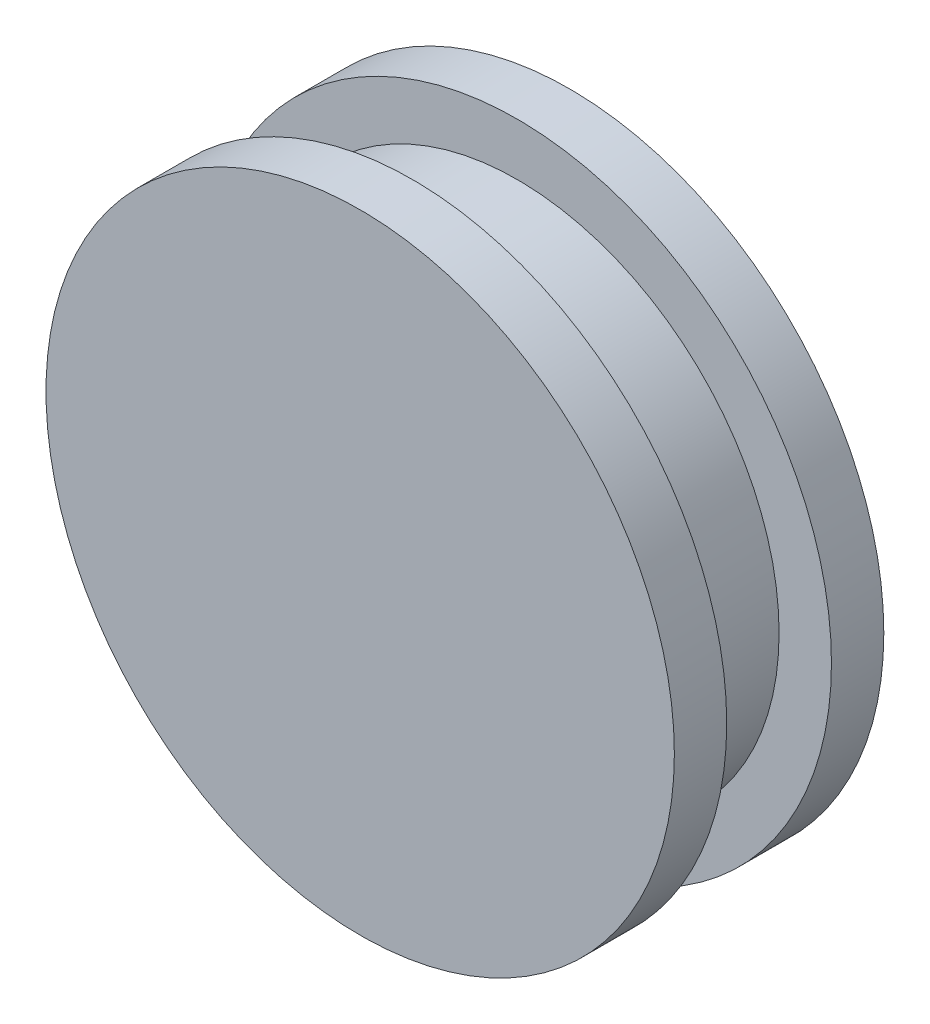
ISO-10303-21;
HEADER;
FILE_DESCRIPTION(('STEP AP214'),'2;1');
FILE_NAME('part.step','',(''),(''),'','','');
FILE_SCHEMA(('AUTOMOTIVE_DESIGN { 1 0 10303 214 1 1 1 1 }'));
ENDSEC;
DATA;
#1=APPLICATION_CONTEXT('core data for automotive mechanical design processes');
#2=APPLICATION_PROTOCOL_DEFINITION('international standard','automotive_design',2000,#1);
#3=PRODUCT_CONTEXT('',#1,'mechanical');
#4=PRODUCT('Part','Part','',(#3));
#5=PRODUCT_RELATED_PRODUCT_CATEGORY('part','',(#4));
#6=PRODUCT_DEFINITION_FORMATION('','',#4);
#7=PRODUCT_DEFINITION_CONTEXT('part definition',#1,'design');
#8=PRODUCT_DEFINITION('design','',#6,#7);
#9=PRODUCT_DEFINITION_SHAPE('','',#8);
#10=(LENGTH_UNIT() NAMED_UNIT(*) SI_UNIT(.MILLI.,.METRE.));
#11=(NAMED_UNIT(*) PLANE_ANGLE_UNIT() SI_UNIT($,.RADIAN.));
#12=(NAMED_UNIT(*) SI_UNIT($,.STERADIAN.) SOLID_ANGLE_UNIT());
#13=UNCERTAINTY_MEASURE_WITH_UNIT(LENGTH_MEASURE(1.E-05),#10,'distance_accuracy_value','');
#14=(GEOMETRIC_REPRESENTATION_CONTEXT(3) GLOBAL_UNCERTAINTY_ASSIGNED_CONTEXT((#13)) GLOBAL_UNIT_ASSIGNED_CONTEXT((#10,
#11,#12)) REPRESENTATION_CONTEXT('',''));
#15=CARTESIAN_POINT('',(0.,0.,0.));
#16=DIRECTION('',(0.,0.,1.));
#17=DIRECTION('',(1.,0.,0.));
#18=AXIS2_PLACEMENT_3D('',#15,#16,#17);
#19=CARTESIAN_POINT('',(0.,0.,50.));
#20=DIRECTION('',(0.,0.,-1.));
#21=DIRECTION('',(-1.,0.,0.));
#22=AXIS2_PLACEMENT_3D('',#19,#20,#21);
#23=CYLINDRICAL_SURFACE('',#22,300.);
#24=CARTESIAN_POINT('',(0.,0.,50.));
#25=DIRECTION('',(0.,0.,1.));
#26=DIRECTION('',(1.,0.,0.));
#27=AXIS2_PLACEMENT_3D('',#24,#25,#26);
#28=CIRCLE('',#27,300.);
#29=CARTESIAN_POINT('',(300.,0.,50.));
#30=VERTEX_POINT('',#29);
#31=EDGE_CURVE('E38',#30,#30,#28,.T.);
#32=ORIENTED_EDGE('',*,*,#31,.F.);
#33=EDGE_LOOP('',(#32));
#34=FACE_BOUND('',#33,.T.);
#35=CARTESIAN_POINT('',(0.,0.,0.));
#36=DIRECTION('',(0.,0.,1.));
#37=DIRECTION('',(1.,0.,0.));
#38=AXIS2_PLACEMENT_3D('',#35,#36,#37);
#39=CIRCLE('',#38,300.);
#40=CARTESIAN_POINT('',(300.,0.,0.));
#41=VERTEX_POINT('',#40);
#42=EDGE_CURVE('E34',#41,#41,#39,.T.);
#43=ORIENTED_EDGE('',*,*,#42,.T.);
#44=EDGE_LOOP('',(#43));
#45=FACE_BOUND('',#44,.T.);
#46=ADVANCED_FACE('F31',(#34,#45),#23,.T.);
#47=CARTESIAN_POINT('',(0.,0.,50.));
#48=DIRECTION('',(0.,0.,1.));
#49=DIRECTION('',(1.,0.,0.));
#50=AXIS2_PLACEMENT_3D('',#47,#48,#49);
#51=PLANE('',#50);
#52=CARTESIAN_POINT('',(0.,0.,50.));
#53=DIRECTION('',(0.,0.,1.));
#54=DIRECTION('',(1.,0.,0.));
#55=AXIS2_PLACEMENT_3D('',#52,#53,#54);
#56=CIRCLE('',#55,250.);
#57=CARTESIAN_POINT('',(250.,0.,50.));
#58=VERTEX_POINT('',#57);
#59=EDGE_CURVE('E10',#58,#58,#56,.T.);
#60=ORIENTED_EDGE('',*,*,#59,.F.);
#61=EDGE_LOOP('',(#60));
#62=FACE_BOUND('',#61,.T.);
#63=ORIENTED_EDGE('',*,*,#31,.T.);
#64=EDGE_LOOP('',(#63));
#65=FACE_BOUND('',#64,.T.);
#66=ADVANCED_FACE('F78',(#62,#65),#51,.T.);
#67=CARTESIAN_POINT('',(0.,0.,0.));
#68=DIRECTION('',(0.,0.,1.));
#69=DIRECTION('',(1.,0.,0.));
#70=AXIS2_PLACEMENT_3D('',#67,#68,#69);
#71=PLANE('',#70);
#72=CARTESIAN_POINT('',(0.,0.,0.));
#73=DIRECTION('',(0.,0.,-1.));
#74=DIRECTION('',(-1.,0.,0.));
#75=AXIS2_PLACEMENT_3D('',#72,#73,#74);
#76=CIRCLE('',#75,20.);
#77=CARTESIAN_POINT('',(-20.,0.,0.));
#78=VERTEX_POINT('',#77);
#79=EDGE_CURVE('E50',#78,#78,#76,.T.);
#80=ORIENTED_EDGE('',*,*,#79,.F.);
#81=EDGE_LOOP('',(#80));
#82=FACE_BOUND('',#81,.T.);
#83=ORIENTED_EDGE('',*,*,#42,.F.);
#84=EDGE_LOOP('',(#83));
#85=FACE_BOUND('',#84,.T.);
#86=ADVANCED_FACE('F83',(#82,#85),#71,.F.);
#87=CARTESIAN_POINT('',(0.,0.,20.));
#88=DIRECTION('',(0.,0.,-1.));
#89=DIRECTION('',(-1.,0.,0.));
#90=AXIS2_PLACEMENT_3D('',#87,#88,#89);
#91=CYLINDRICAL_SURFACE('',#90,20.);
#92=CARTESIAN_POINT('',(0.,0.,20.));
#93=DIRECTION('',(0.,0.,-1.));
#94=DIRECTION('',(-1.,0.,0.));
#95=AXIS2_PLACEMENT_3D('',#92,#93,#94);
#96=CIRCLE('',#95,20.);
#97=CARTESIAN_POINT('',(-20.,0.,20.));
#98=VERTEX_POINT('',#97);
#99=EDGE_CURVE('E47',#98,#98,#96,.T.);
#100=ORIENTED_EDGE('',*,*,#99,.F.);
#101=EDGE_LOOP('',(#100));
#102=FACE_BOUND('',#101,.T.);
#103=ORIENTED_EDGE('',*,*,#79,.T.);
#104=EDGE_LOOP('',(#103));
#105=FACE_BOUND('',#104,.T.);
#106=ADVANCED_FACE('F92',(#102,#105),#91,.F.);
#107=CARTESIAN_POINT('',(0.,0.,20.));
#108=DIRECTION('',(0.,0.,-1.));
#109=DIRECTION('',(-1.,0.,0.));
#110=AXIS2_PLACEMENT_3D('',#107,#108,#109);
#111=PLANE('',#110);
#112=ORIENTED_EDGE('',*,*,#99,.T.);
#113=EDGE_LOOP('',(#112));
#114=FACE_BOUND('',#113,.T.);
#115=ADVANCED_FACE('F97',(#114),#111,.T.);
#116=CARTESIAN_POINT('',(0.,0.,150.));
#117=DIRECTION('',(0.,0.,-1.));
#118=DIRECTION('',(-1.,0.,0.));
#119=AXIS2_PLACEMENT_3D('',#116,#117,#118);
#120=CYLINDRICAL_SURFACE('',#119,250.);
#121=CARTESIAN_POINT('',(0.,0.,150.));
#122=DIRECTION('',(0.,0.,1.));
#123=DIRECTION('',(1.,0.,0.));
#124=AXIS2_PLACEMENT_3D('',#121,#122,#123);
#125=CIRCLE('',#124,250.);
#126=CARTESIAN_POINT('',(250.,0.,150.));
#127=VERTEX_POINT('',#126);
#128=EDGE_CURVE('E45',#127,#127,#125,.T.);
#129=ORIENTED_EDGE('',*,*,#128,.F.);
#130=EDGE_LOOP('',(#129));
#131=FACE_BOUND('',#130,.T.);
#132=ORIENTED_EDGE('',*,*,#59,.T.);
#133=EDGE_LOOP('',(#132));
#134=FACE_BOUND('',#133,.T.);
#135=ADVANCED_FACE('F103',(#131,#134),#120,.T.);
#136=CARTESIAN_POINT('',(0.,0.,200.));
#137=DIRECTION('',(0.,0.,-1.));
#138=DIRECTION('',(-1.,0.,0.));
#139=AXIS2_PLACEMENT_3D('',#136,#137,#138);
#140=CYLINDRICAL_SURFACE('',#139,300.);
#141=CARTESIAN_POINT('',(0.,0.,200.));
#142=DIRECTION('',(0.,0.,1.));
#143=DIRECTION('',(1.,0.,0.));
#144=AXIS2_PLACEMENT_3D('',#141,#142,#143);
#145=CIRCLE('',#144,300.);
#146=CARTESIAN_POINT('',(300.,0.,200.));
#147=VERTEX_POINT('',#146);
#148=EDGE_CURVE('E55',#147,#147,#145,.T.);
#149=ORIENTED_EDGE('',*,*,#148,.F.);
#150=EDGE_LOOP('',(#149));
#151=FACE_BOUND('',#150,.T.);
#152=CARTESIAN_POINT('',(0.,0.,150.));
#153=DIRECTION('',(0.,0.,1.));
#154=DIRECTION('',(1.,0.,0.));
#155=AXIS2_PLACEMENT_3D('',#152,#153,#154);
#156=CIRCLE('',#155,300.);
#157=CARTESIAN_POINT('',(300.,0.,150.));
#158=VERTEX_POINT('',#157);
#159=EDGE_CURVE('E59',#158,#158,#156,.T.);
#160=ORIENTED_EDGE('',*,*,#159,.T.);
#161=EDGE_LOOP('',(#160));
#162=FACE_BOUND('',#161,.T.);
#163=ADVANCED_FACE('F66',(#151,#162),#140,.T.);
#164=CARTESIAN_POINT('',(0.,0.,200.));
#165=DIRECTION('',(0.,0.,1.));
#166=DIRECTION('',(1.,0.,0.));
#167=AXIS2_PLACEMENT_3D('',#164,#165,#166);
#168=PLANE('',#167);
#169=ORIENTED_EDGE('',*,*,#148,.T.);
#170=EDGE_LOOP('',(#169));
#171=FACE_BOUND('',#170,.T.);
#172=ADVANCED_FACE('F70',(#171),#168,.T.);
#173=CARTESIAN_POINT('',(0.,0.,150.));
#174=DIRECTION('',(0.,0.,1.));
#175=DIRECTION('',(1.,0.,0.));
#176=AXIS2_PLACEMENT_3D('',#173,#174,#175);
#177=PLANE('',#176);
#178=ORIENTED_EDGE('',*,*,#128,.T.);
#179=EDGE_LOOP('',(#178));
#180=FACE_BOUND('',#179,.T.);
#181=ORIENTED_EDGE('',*,*,#159,.F.);
#182=EDGE_LOOP('',(#181));
#183=FACE_BOUND('',#182,.T.);
#184=ADVANCED_FACE('F68',(#180,#183),#177,.F.);
#185=CLOSED_SHELL('',(#46,#66,#86,#106,#115,#135,#163,#172,#184));
#186=MANIFOLD_SOLID_BREP('B2',#185);
#187=ADVANCED_BREP_SHAPE_REPRESENTATION('',(#18,#186),#14);
#188=SHAPE_DEFINITION_REPRESENTATION(#9,#187);
ENDSEC;
END-ISO-10303-21;
